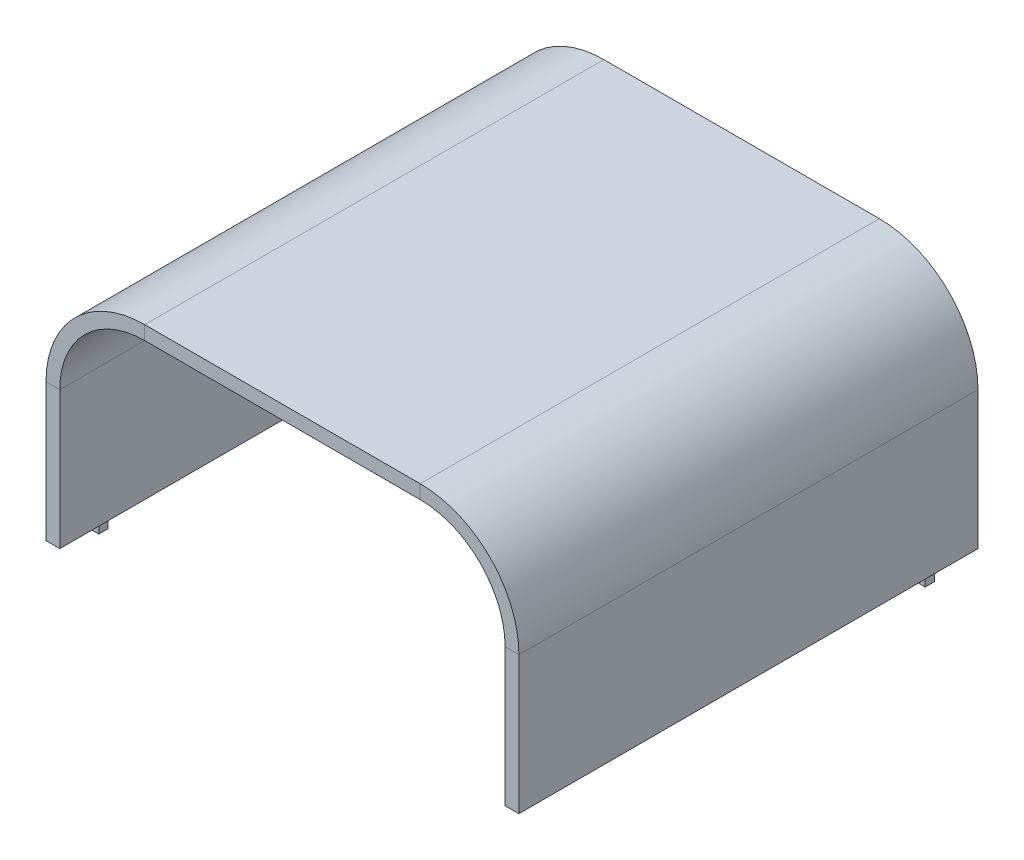
ISO-10303-21;
HEADER;
FILE_DESCRIPTION(('STEP AP214'),'2;1');
FILE_NAME('part.step','',(''),(''),'','','');
FILE_SCHEMA(('AUTOMOTIVE_DESIGN { 1 0 10303 214 1 1 1 1 }'));
ENDSEC;
DATA;
#1=APPLICATION_CONTEXT('core data for automotive mechanical design processes');
#2=APPLICATION_PROTOCOL_DEFINITION('international standard','automotive_design',2000,#1);
#3=PRODUCT_CONTEXT('',#1,'mechanical');
#4=PRODUCT('Part','Part','',(#3));
#5=PRODUCT_RELATED_PRODUCT_CATEGORY('part','',(#4));
#6=PRODUCT_DEFINITION_FORMATION('','',#4);
#7=PRODUCT_DEFINITION_CONTEXT('part definition',#1,'design');
#8=PRODUCT_DEFINITION('design','',#6,#7);
#9=PRODUCT_DEFINITION_SHAPE('','',#8);
#10=(LENGTH_UNIT() NAMED_UNIT(*) SI_UNIT(.MILLI.,.METRE.));
#11=(NAMED_UNIT(*) PLANE_ANGLE_UNIT() SI_UNIT($,.RADIAN.));
#12=(NAMED_UNIT(*) SI_UNIT($,.STERADIAN.) SOLID_ANGLE_UNIT());
#13=UNCERTAINTY_MEASURE_WITH_UNIT(LENGTH_MEASURE(1.E-05),#10,'distance_accuracy_value','');
#14=(GEOMETRIC_REPRESENTATION_CONTEXT(3) GLOBAL_UNCERTAINTY_ASSIGNED_CONTEXT((#13)) GLOBAL_UNIT_ASSIGNED_CONTEXT((#10,
#11,#12)) REPRESENTATION_CONTEXT('',''));
#15=CARTESIAN_POINT('',(0.,0.,0.));
#16=DIRECTION('',(0.,0.,1.));
#17=DIRECTION('',(1.,0.,0.));
#18=AXIS2_PLACEMENT_3D('',#15,#16,#17);
#19=CARTESIAN_POINT('',(0.,0.,0.));
#20=DIRECTION('',(0.,-1.,0.));
#21=DIRECTION('',(0.,0.,-1.));
#22=AXIS2_PLACEMENT_3D('',#19,#20,#21);
#23=PLANE('',#22);
#24=DIRECTION('',(0.,0.,-1.));
#25=VECTOR('',#24,1.);
#26=CARTESIAN_POINT('',(-244.999999999999,0.,-6.80011602582914E-13));
#27=LINE('',#26,#25);
#28=CARTESIAN_POINT('',(-245.,0.,205.));
#29=VERTEX_POINT('',#28);
#30=CARTESIAN_POINT('',(-245.,0.,195.));
#31=VERTEX_POINT('',#30);
#32=EDGE_CURVE('E315',#29,#31,#27,.T.);
#33=ORIENTED_EDGE('',*,*,#32,.T.);
#34=DIRECTION('',(1.,0.,0.));
#35=VECTOR('',#34,1.);
#36=CARTESIAN_POINT('',(0.,0.,195.));
#37=LINE('',#36,#35);
#38=CARTESIAN_POINT('',(-255.,0.,195.));
#39=VERTEX_POINT('',#38);
#40=EDGE_CURVE('E320',#39,#31,#37,.T.);
#41=ORIENTED_EDGE('',*,*,#40,.F.);
#42=DIRECTION('',(0.,0.,-1.));
#43=VECTOR('',#42,1.);
#44=CARTESIAN_POINT('',(-255.,0.,0.));
#45=LINE('',#44,#43);
#46=CARTESIAN_POINT('',(-255.,0.,205.));
#47=VERTEX_POINT('',#46);
#48=EDGE_CURVE('E333',#47,#39,#45,.T.);
#49=ORIENTED_EDGE('',*,*,#48,.F.);
#50=DIRECTION('',(1.,0.,0.));
#51=VECTOR('',#50,1.);
#52=CARTESIAN_POINT('',(5.68989300120396E-13,0.,204.999999999999));
#53=LINE('',#52,#51);
#54=EDGE_CURVE('E330',#47,#29,#53,.T.);
#55=ORIENTED_EDGE('',*,*,#54,.T.);
#56=EDGE_LOOP('',(#33,#41,#49,#55));
#57=FACE_BOUND('',#56,.T.);
#58=DIRECTION('',(0.,0.,-1.));
#59=VECTOR('',#58,1.);
#60=CARTESIAN_POINT('',(-242.5,0.,249.999999999999));
#61=LINE('',#60,#59);
#62=CARTESIAN_POINT('',(-242.5,0.,249.999999999999));
#63=VERTEX_POINT('',#62);
#64=CARTESIAN_POINT('',(-242.5,0.,-250.000000000001));
#65=VERTEX_POINT('',#64);
#66=EDGE_CURVE('E345',#63,#65,#61,.T.);
#67=ORIENTED_EDGE('',*,*,#66,.F.);
#68=DIRECTION('',(1.,0.,0.));
#69=VECTOR('',#68,1.);
#70=CARTESIAN_POINT('',(-257.5,0.,249.999999999999));
#71=LINE('',#70,#69);
#72=CARTESIAN_POINT('',(-257.5,0.,249.999999999999));
#73=VERTEX_POINT('',#72);
#74=EDGE_CURVE('E359',#73,#63,#71,.T.);
#75=ORIENTED_EDGE('',*,*,#74,.F.);
#76=DIRECTION('',(0.,0.,1.));
#77=VECTOR('',#76,1.);
#78=CARTESIAN_POINT('',(-257.5,0.,249.999999999999));
#79=LINE('',#78,#77);
#80=CARTESIAN_POINT('',(-257.5,0.,-250.000000000001));
#81=VERTEX_POINT('',#80);
#82=EDGE_CURVE('E405',#81,#73,#79,.T.);
#83=ORIENTED_EDGE('',*,*,#82,.F.);
#84=DIRECTION('',(-1.,0.,0.));
#85=VECTOR('',#84,1.);
#86=CARTESIAN_POINT('',(-257.5,0.,-250.000000000001));
#87=LINE('',#86,#85);
#88=EDGE_CURVE('E348',#65,#81,#87,.T.);
#89=ORIENTED_EDGE('',*,*,#88,.F.);
#90=EDGE_LOOP('',(#67,#75,#83,#89));
#91=FACE_BOUND('',#90,.T.);
#92=DIRECTION('',(1.,0.,0.));
#93=VECTOR('',#92,1.);
#94=CARTESIAN_POINT('',(-5.41233724504769E-13,0.,-195.000000000001));
#95=LINE('',#94,#93);
#96=CARTESIAN_POINT('',(-255.,0.,-195.));
#97=VERTEX_POINT('',#96);
#98=CARTESIAN_POINT('',(-245.,0.,-195.));
#99=VERTEX_POINT('',#98);
#100=EDGE_CURVE('E246',#97,#99,#95,.T.);
#101=ORIENTED_EDGE('',*,*,#100,.T.);
#102=DIRECTION('',(0.,0.,-1.));
#103=VECTOR('',#102,1.);
#104=CARTESIAN_POINT('',(-245.,0.,0.));
#105=LINE('',#104,#103);
#106=CARTESIAN_POINT('',(-245.,0.,-205.));
#107=VERTEX_POINT('',#106);
#108=EDGE_CURVE('E48',#99,#107,#105,.T.);
#109=ORIENTED_EDGE('',*,*,#108,.T.);
#110=DIRECTION('',(1.,0.,0.));
#111=VECTOR('',#110,1.);
#112=CARTESIAN_POINT('',(-5.68989300120398E-13,0.,-205.000000000001));
#113=LINE('',#112,#111);
#114=CARTESIAN_POINT('',(-255.,0.,-205.));
#115=VERTEX_POINT('',#114);
#116=EDGE_CURVE('E237',#115,#107,#113,.T.);
#117=ORIENTED_EDGE('',*,*,#116,.F.);
#118=DIRECTION('',(0.,0.,-1.));
#119=VECTOR('',#118,1.);
#120=CARTESIAN_POINT('',(-255.,0.,0.));
#121=LINE('',#120,#119);
#122=EDGE_CURVE('E240',#97,#115,#121,.T.);
#123=ORIENTED_EDGE('',*,*,#122,.F.);
#124=EDGE_LOOP('',(#101,#109,#117,#123));
#125=FACE_BOUND('',#124,.T.);
#126=ADVANCED_FACE('F34',(#57,#91,#125),#23,.T.);
#127=CARTESIAN_POINT('',(0.,0.,0.));
#128=DIRECTION('',(0.,1.,0.));
#129=DIRECTION('',(0.,0.,-1.));
#130=AXIS2_PLACEMENT_3D('',#127,#128,#129);
#131=PLANE('',#130);
#132=DIRECTION('',(1.,0.,0.));
#133=VECTOR('',#132,1.);
#134=CARTESIAN_POINT('',(245.,0.,195.));
#135=LINE('',#134,#133);
#136=CARTESIAN_POINT('',(245.,0.,195.));
#137=VERTEX_POINT('',#136);
#138=CARTESIAN_POINT('',(255.,0.,195.));
#139=VERTEX_POINT('',#138);
#140=EDGE_CURVE('E272',#137,#139,#135,.T.);
#141=ORIENTED_EDGE('',*,*,#140,.F.);
#142=DIRECTION('',(0.,0.,-1.));
#143=VECTOR('',#142,1.);
#144=CARTESIAN_POINT('',(245.,0.,205.));
#145=LINE('',#144,#143);
#146=CARTESIAN_POINT('',(245.,0.,205.));
#147=VERTEX_POINT('',#146);
#148=EDGE_CURVE('E56',#147,#137,#145,.T.);
#149=ORIENTED_EDGE('',*,*,#148,.F.);
#150=DIRECTION('',(1.,0.,0.));
#151=VECTOR('',#150,1.);
#152=CARTESIAN_POINT('',(245.,0.,205.));
#153=LINE('',#152,#151);
#154=CARTESIAN_POINT('',(255.,0.,205.));
#155=VERTEX_POINT('',#154);
#156=EDGE_CURVE('E265',#147,#155,#153,.T.);
#157=ORIENTED_EDGE('',*,*,#156,.T.);
#158=DIRECTION('',(0.,0.,-1.));
#159=VECTOR('',#158,1.);
#160=CARTESIAN_POINT('',(255.,0.,205.));
#161=LINE('',#160,#159);
#162=EDGE_CURVE('E268',#155,#139,#161,.T.);
#163=ORIENTED_EDGE('',*,*,#162,.T.);
#164=EDGE_LOOP('',(#141,#149,#157,#163));
#165=FACE_BOUND('',#164,.T.);
#166=DIRECTION('',(1.,0.,0.));
#167=VECTOR('',#166,1.);
#168=CARTESIAN_POINT('',(5.41233724504768E-13,0.,-195.000000000001));
#169=LINE('',#168,#167);
#170=CARTESIAN_POINT('',(245.,0.,-195.));
#171=VERTEX_POINT('',#170);
#172=CARTESIAN_POINT('',(255.,0.,-195.));
#173=VERTEX_POINT('',#172);
#174=EDGE_CURVE('E297',#171,#173,#169,.T.);
#175=ORIENTED_EDGE('',*,*,#174,.T.);
#176=DIRECTION('',(0.,0.,-1.));
#177=VECTOR('',#176,1.);
#178=CARTESIAN_POINT('',(255.000000000001,0.,-1.41553435639709E-12));
#179=LINE('',#178,#177);
#180=CARTESIAN_POINT('',(255.,0.,-205.));
#181=VERTEX_POINT('',#180);
#182=EDGE_CURVE('E252',#173,#181,#179,.T.);
#183=ORIENTED_EDGE('',*,*,#182,.T.);
#184=DIRECTION('',(1.,0.,0.));
#185=VECTOR('',#184,1.);
#186=CARTESIAN_POINT('',(0.,0.,-205.));
#187=LINE('',#186,#185);
#188=CARTESIAN_POINT('',(245.,0.,-205.));
#189=VERTEX_POINT('',#188);
#190=EDGE_CURVE('E288',#189,#181,#187,.T.);
#191=ORIENTED_EDGE('',*,*,#190,.F.);
#192=DIRECTION('',(0.,0.,-1.));
#193=VECTOR('',#192,1.);
#194=CARTESIAN_POINT('',(245.,0.,0.));
#195=LINE('',#194,#193);
#196=EDGE_CURVE('E299',#171,#189,#195,.T.);
#197=ORIENTED_EDGE('',*,*,#196,.F.);
#198=EDGE_LOOP('',(#175,#183,#191,#197));
#199=FACE_BOUND('',#198,.T.);
#200=DIRECTION('',(0.,0.,-1.));
#201=VECTOR('',#200,1.);
#202=CARTESIAN_POINT('',(242.5,0.,249.999999999999));
#203=LINE('',#202,#201);
#204=CARTESIAN_POINT('',(242.5,0.,249.999999999999));
#205=VERTEX_POINT('',#204);
#206=CARTESIAN_POINT('',(242.5,0.,-250.000000000001));
#207=VERTEX_POINT('',#206);
#208=EDGE_CURVE('E393',#205,#207,#203,.T.);
#209=ORIENTED_EDGE('',*,*,#208,.T.);
#210=DIRECTION('',(1.,0.,0.));
#211=VECTOR('',#210,1.);
#212=CARTESIAN_POINT('',(257.5,0.,-250.000000000001));
#213=LINE('',#212,#211);
#214=CARTESIAN_POINT('',(257.5,0.,-250.000000000001));
#215=VERTEX_POINT('',#214);
#216=EDGE_CURVE('E399',#207,#215,#213,.T.);
#217=ORIENTED_EDGE('',*,*,#216,.T.);
#218=DIRECTION('',(0.,0.,1.));
#219=VECTOR('',#218,1.);
#220=CARTESIAN_POINT('',(257.5,0.,249.999999999999));
#221=LINE('',#220,#219);
#222=CARTESIAN_POINT('',(257.5,0.,249.999999999999));
#223=VERTEX_POINT('',#222);
#224=EDGE_CURVE('E434',#215,#223,#221,.T.);
#225=ORIENTED_EDGE('',*,*,#224,.T.);
#226=DIRECTION('',(-1.,0.,0.));
#227=VECTOR('',#226,1.);
#228=CARTESIAN_POINT('',(257.5,0.,249.999999999999));
#229=LINE('',#228,#227);
#230=EDGE_CURVE('E11',#223,#205,#229,.T.);
#231=ORIENTED_EDGE('',*,*,#230,.T.);
#232=EDGE_LOOP('',(#209,#217,#225,#231));
#233=FACE_BOUND('',#232,.T.);
#234=ADVANCED_FACE('F523',(#165,#199,#233),#131,.F.);
#235=CARTESIAN_POINT('',(-242.5,0.,249.999999999999));
#236=DIRECTION('',(1.,0.,0.));
#237=DIRECTION('',(0.,0.,-1.));
#238=AXIS2_PLACEMENT_3D('',#235,#236,#237);
#239=PLANE('',#238);
#240=DIRECTION('',(0.,1.,0.));
#241=VECTOR('',#240,1.);
#242=CARTESIAN_POINT('',(-242.5,0.,-250.000000000001));
#243=LINE('',#242,#241);
#244=CARTESIAN_POINT('',(-242.5,149.999999999999,-250.000000000001));
#245=VERTEX_POINT('',#244);
#246=EDGE_CURVE('E352',#65,#245,#243,.T.);
#247=ORIENTED_EDGE('',*,*,#246,.T.);
#248=DIRECTION('',(0.,0.,-1.));
#249=VECTOR('',#248,1.);
#250=CARTESIAN_POINT('',(-242.5,149.999999999999,249.999999999999));
#251=LINE('',#250,#249);
#252=CARTESIAN_POINT('',(-242.5,149.999999999999,249.999999999999));
#253=VERTEX_POINT('',#252);
#254=EDGE_CURVE('E349',#253,#245,#251,.T.);
#255=ORIENTED_EDGE('',*,*,#254,.F.);
#256=DIRECTION('',(0.,1.,0.));
#257=VECTOR('',#256,1.);
#258=CARTESIAN_POINT('',(-242.5,0.,249.999999999999));
#259=LINE('',#258,#257);
#260=EDGE_CURVE('E353',#63,#253,#259,.T.);
#261=ORIENTED_EDGE('',*,*,#260,.F.);
#262=ORIENTED_EDGE('',*,*,#66,.T.);
#263=EDGE_LOOP('',(#247,#255,#261,#262));
#264=FACE_BOUND('',#263,.T.);
#265=ADVANCED_FACE('F496',(#264),#239,.T.);
#266=CARTESIAN_POINT('',(-257.5,0.,-250.000000000001));
#267=DIRECTION('',(0.,0.,-1.));
#268=DIRECTION('',(-1.,0.,0.));
#269=AXIS2_PLACEMENT_3D('',#266,#267,#268);
#270=PLANE('',#269);
#271=DIRECTION('',(0.,1.,0.));
#272=VECTOR('',#271,1.);
#273=CARTESIAN_POINT('',(-257.5,0.,-250.000000000001));
#274=LINE('',#273,#272);
#275=CARTESIAN_POINT('',(-257.5,149.999999999999,-250.000000000001));
#276=VERTEX_POINT('',#275);
#277=EDGE_CURVE('E408',#81,#276,#274,.T.);
#278=ORIENTED_EDGE('',*,*,#277,.T.);
#279=DIRECTION('',(-1.,0.,0.));
#280=VECTOR('',#279,1.);
#281=CARTESIAN_POINT('',(-257.5,149.999999999999,-250.000000000001));
#282=LINE('',#281,#280);
#283=EDGE_CURVE('E356',#245,#276,#282,.T.);
#284=ORIENTED_EDGE('',*,*,#283,.F.);
#285=ORIENTED_EDGE('',*,*,#246,.F.);
#286=ORIENTED_EDGE('',*,*,#88,.T.);
#287=EDGE_LOOP('',(#278,#284,#285,#286));
#288=FACE_BOUND('',#287,.T.);
#289=ADVANCED_FACE('F507',(#288),#270,.T.);
#290=CARTESIAN_POINT('',(-257.5,0.,249.999999999999));
#291=DIRECTION('',(-1.,0.,0.));
#292=DIRECTION('',(0.,0.,1.));
#293=AXIS2_PLACEMENT_3D('',#290,#291,#292);
#294=PLANE('',#293);
#295=DIRECTION('',(0.,1.,0.));
#296=VECTOR('',#295,1.);
#297=CARTESIAN_POINT('',(-257.5,0.,249.999999999999));
#298=LINE('',#297,#296);
#299=CARTESIAN_POINT('',(-257.5,149.999999999999,249.999999999999));
#300=VERTEX_POINT('',#299);
#301=EDGE_CURVE('E439',#73,#300,#298,.T.);
#302=ORIENTED_EDGE('',*,*,#301,.T.);
#303=DIRECTION('',(0.,0.,1.));
#304=VECTOR('',#303,1.);
#305=CARTESIAN_POINT('',(-257.5,149.999999999999,249.999999999999));
#306=LINE('',#305,#304);
#307=EDGE_CURVE('E411',#276,#300,#306,.T.);
#308=ORIENTED_EDGE('',*,*,#307,.F.);
#309=ORIENTED_EDGE('',*,*,#277,.F.);
#310=ORIENTED_EDGE('',*,*,#82,.T.);
#311=EDGE_LOOP('',(#302,#308,#309,#310));
#312=FACE_BOUND('',#311,.T.);
#313=ADVANCED_FACE('F503',(#312),#294,.T.);
#314=CARTESIAN_POINT('',(-257.5,0.,249.999999999999));
#315=DIRECTION('',(0.,0.,1.));
#316=DIRECTION('',(1.,0.,0.));
#317=AXIS2_PLACEMENT_3D('',#314,#315,#316);
#318=PLANE('',#317);
#319=DIRECTION('',(1.,0.,0.));
#320=VECTOR('',#319,1.);
#321=CARTESIAN_POINT('',(-257.5,149.999999999999,249.999999999999));
#322=LINE('',#321,#320);
#323=EDGE_CURVE('E370',#300,#253,#322,.T.);
#324=ORIENTED_EDGE('',*,*,#323,.F.);
#325=ORIENTED_EDGE('',*,*,#301,.F.);
#326=ORIENTED_EDGE('',*,*,#74,.T.);
#327=ORIENTED_EDGE('',*,*,#260,.T.);
#328=EDGE_LOOP('',(#324,#325,#326,#327));
#329=FACE_BOUND('',#328,.T.);
#330=ADVANCED_FACE('F498',(#329),#318,.T.);
#331=CARTESIAN_POINT('',(-150.,150.,0.));
#332=DIRECTION('',(0.,0.,-1.));
#333=DIRECTION('',(-1.,0.,0.));
#334=AXIS2_PLACEMENT_3D('',#331,#332,#333);
#335=CYLINDRICAL_SURFACE('',#334,92.5);
#336=CARTESIAN_POINT('',(-150.,150.,-250.000000000001));
#337=DIRECTION('',(0.,0.,-1.));
#338=DIRECTION('',(-1.,0.,0.));
#339=AXIS2_PLACEMENT_3D('',#336,#337,#338);
#340=CIRCLE('',#339,92.5);
#341=CARTESIAN_POINT('',(-149.999999999999,242.5,-250.000000000001));
#342=VERTEX_POINT('',#341);
#343=EDGE_CURVE('E363',#245,#342,#340,.T.);
#344=ORIENTED_EDGE('',*,*,#343,.T.);
#345=DIRECTION('',(0.,0.,-1.));
#346=VECTOR('',#345,1.);
#347=CARTESIAN_POINT('',(-149.999999999999,242.5,249.999999999999));
#348=LINE('',#347,#346);
#349=CARTESIAN_POINT('',(-149.999999999999,242.5,249.999999999999));
#350=VERTEX_POINT('',#349);
#351=EDGE_CURVE('E360',#350,#342,#348,.T.);
#352=ORIENTED_EDGE('',*,*,#351,.F.);
#353=CARTESIAN_POINT('',(-150.,150.,249.999999999999));
#354=DIRECTION('',(0.,0.,-1.));
#355=DIRECTION('',(-1.,0.,0.));
#356=AXIS2_PLACEMENT_3D('',#353,#354,#355);
#357=CIRCLE('',#356,92.5);
#358=EDGE_CURVE('E364',#253,#350,#357,.T.);
#359=ORIENTED_EDGE('',*,*,#358,.F.);
#360=ORIENTED_EDGE('',*,*,#254,.T.);
#361=EDGE_LOOP('',(#344,#352,#359,#360));
#362=FACE_BOUND('',#361,.T.);
#363=ADVANCED_FACE('F488',(#362),#335,.F.);
#364=CARTESIAN_POINT('',(-257.5,150.000000000001,-250.000000000001));
#365=DIRECTION('',(0.,0.,-1.));
#366=DIRECTION('',(-1.,0.,0.));
#367=AXIS2_PLACEMENT_3D('',#364,#365,#366);
#368=PLANE('',#367);
#369=CARTESIAN_POINT('',(-150.,150.,-250.000000000001));
#370=DIRECTION('',(0.,0.,-1.));
#371=DIRECTION('',(-1.,0.,0.));
#372=AXIS2_PLACEMENT_3D('',#369,#370,#371);
#373=CIRCLE('',#372,107.5);
#374=CARTESIAN_POINT('',(-149.999999999999,257.5,-250.000000000001));
#375=VERTEX_POINT('',#374);
#376=EDGE_CURVE('E414',#276,#375,#373,.T.);
#377=ORIENTED_EDGE('',*,*,#376,.T.);
#378=DIRECTION('',(0.,1.,0.));
#379=VECTOR('',#378,1.);
#380=CARTESIAN_POINT('',(-149.999999999999,257.5,-250.000000000001));
#381=LINE('',#380,#379);
#382=EDGE_CURVE('E367',#342,#375,#381,.T.);
#383=ORIENTED_EDGE('',*,*,#382,.F.);
#384=ORIENTED_EDGE('',*,*,#343,.F.);
#385=ORIENTED_EDGE('',*,*,#283,.T.);
#386=EDGE_LOOP('',(#377,#383,#384,#385));
#387=FACE_BOUND('',#386,.T.);
#388=ADVANCED_FACE('F509',(#387),#368,.T.);
#389=CARTESIAN_POINT('',(-150.,150.,0.));
#390=DIRECTION('',(0.,0.,-1.));
#391=DIRECTION('',(-1.,0.,0.));
#392=AXIS2_PLACEMENT_3D('',#389,#390,#391);
#393=CYLINDRICAL_SURFACE('',#392,107.5);
#394=CARTESIAN_POINT('',(-150.,150.,249.999999999999));
#395=DIRECTION('',(0.,0.,-1.));
#396=DIRECTION('',(-1.,0.,0.));
#397=AXIS2_PLACEMENT_3D('',#394,#395,#396);
#398=CIRCLE('',#397,107.5);
#399=CARTESIAN_POINT('',(-149.999999999999,257.5,249.999999999999));
#400=VERTEX_POINT('',#399);
#401=EDGE_CURVE('E444',#300,#400,#398,.T.);
#402=ORIENTED_EDGE('',*,*,#401,.T.);
#403=DIRECTION('',(0.,0.,1.));
#404=VECTOR('',#403,1.);
#405=CARTESIAN_POINT('',(-149.999999999999,257.5,249.999999999999));
#406=LINE('',#405,#404);
#407=EDGE_CURVE('E417',#375,#400,#406,.T.);
#408=ORIENTED_EDGE('',*,*,#407,.F.);
#409=ORIENTED_EDGE('',*,*,#376,.F.);
#410=ORIENTED_EDGE('',*,*,#307,.T.);
#411=EDGE_LOOP('',(#402,#408,#409,#410));
#412=FACE_BOUND('',#411,.T.);
#413=ADVANCED_FACE('F535',(#412),#393,.T.);
#414=CARTESIAN_POINT('',(-257.5,150.000000000001,249.999999999999));
#415=DIRECTION('',(0.,0.,1.));
#416=DIRECTION('',(1.,0.,0.));
#417=AXIS2_PLACEMENT_3D('',#414,#415,#416);
#418=PLANE('',#417);
#419=DIRECTION('',(0.,-1.,0.));
#420=VECTOR('',#419,1.);
#421=CARTESIAN_POINT('',(-149.999999999999,257.5,249.999999999999));
#422=LINE('',#421,#420);
#423=EDGE_CURVE('E381',#400,#350,#422,.T.);
#424=ORIENTED_EDGE('',*,*,#423,.F.);
#425=ORIENTED_EDGE('',*,*,#401,.F.);
#426=ORIENTED_EDGE('',*,*,#323,.T.);
#427=ORIENTED_EDGE('',*,*,#358,.T.);
#428=EDGE_LOOP('',(#424,#425,#426,#427));
#429=FACE_BOUND('',#428,.T.);
#430=ADVANCED_FACE('F489',(#429),#418,.T.);
#431=CARTESIAN_POINT('',(-149.999999999999,242.5,249.999999999999));
#432=DIRECTION('',(0.,-1.,0.));
#433=DIRECTION('',(1.,0.,0.));
#434=AXIS2_PLACEMENT_3D('',#431,#432,#433);
#435=PLANE('',#434);
#436=DIRECTION('',(1.,0.,0.));
#437=VECTOR('',#436,1.);
#438=CARTESIAN_POINT('',(-149.999999999999,242.5,-250.000000000001));
#439=LINE('',#438,#437);
#440=CARTESIAN_POINT('',(149.999999999999,242.5,-250.000000000001));
#441=VERTEX_POINT('',#440);
#442=EDGE_CURVE('E374',#342,#441,#439,.T.);
#443=ORIENTED_EDGE('',*,*,#442,.T.);
#444=DIRECTION('',(0.,0.,-1.));
#445=VECTOR('',#444,1.);
#446=CARTESIAN_POINT('',(149.999999999999,242.5,249.999999999999));
#447=LINE('',#446,#445);
#448=CARTESIAN_POINT('',(149.999999999999,242.5,249.999999999999));
#449=VERTEX_POINT('',#448);
#450=EDGE_CURVE('E371',#449,#441,#447,.T.);
#451=ORIENTED_EDGE('',*,*,#450,.F.);
#452=DIRECTION('',(1.,0.,0.));
#453=VECTOR('',#452,1.);
#454=CARTESIAN_POINT('',(-149.999999999999,242.5,249.999999999999));
#455=LINE('',#454,#453);
#456=EDGE_CURVE('E375',#350,#449,#455,.T.);
#457=ORIENTED_EDGE('',*,*,#456,.F.);
#458=ORIENTED_EDGE('',*,*,#351,.T.);
#459=EDGE_LOOP('',(#443,#451,#457,#458));
#460=FACE_BOUND('',#459,.T.);
#461=ADVANCED_FACE('F482',(#460),#435,.T.);
#462=CARTESIAN_POINT('',(-149.999999999999,257.5,-250.000000000001));
#463=DIRECTION('',(0.,0.,-1.));
#464=DIRECTION('',(-1.,0.,0.));
#465=AXIS2_PLACEMENT_3D('',#462,#463,#464);
#466=PLANE('',#465);
#467=DIRECTION('',(1.,0.,0.));
#468=VECTOR('',#467,1.);
#469=CARTESIAN_POINT('',(-149.999999999999,257.5,-250.000000000001));
#470=LINE('',#469,#468);
#471=CARTESIAN_POINT('',(149.999999999999,257.5,-250.000000000001));
#472=VERTEX_POINT('',#471);
#473=EDGE_CURVE('E420',#375,#472,#470,.T.);
#474=ORIENTED_EDGE('',*,*,#473,.T.);
#475=DIRECTION('',(0.,1.,0.));
#476=VECTOR('',#475,1.);
#477=CARTESIAN_POINT('',(149.999999999999,257.5,-250.000000000001));
#478=LINE('',#477,#476);
#479=EDGE_CURVE('E378',#441,#472,#478,.T.);
#480=ORIENTED_EDGE('',*,*,#479,.F.);
#481=ORIENTED_EDGE('',*,*,#442,.F.);
#482=ORIENTED_EDGE('',*,*,#382,.T.);
#483=EDGE_LOOP('',(#474,#480,#481,#482));
#484=FACE_BOUND('',#483,.T.);
#485=ADVANCED_FACE('F512',(#484),#466,.T.);
#486=CARTESIAN_POINT('',(-149.999999999999,257.5,249.999999999999));
#487=DIRECTION('',(0.,1.,0.));
#488=DIRECTION('',(-1.,0.,0.));
#489=AXIS2_PLACEMENT_3D('',#486,#487,#488);
#490=PLANE('',#489);
#491=DIRECTION('',(1.,0.,0.));
#492=VECTOR('',#491,1.);
#493=CARTESIAN_POINT('',(-149.999999999999,257.5,249.999999999999));
#494=LINE('',#493,#492);
#495=CARTESIAN_POINT('',(149.999999999999,257.5,249.999999999999));
#496=VERTEX_POINT('',#495);
#497=EDGE_CURVE('E449',#400,#496,#494,.T.);
#498=ORIENTED_EDGE('',*,*,#497,.T.);
#499=DIRECTION('',(0.,0.,1.));
#500=VECTOR('',#499,1.);
#501=CARTESIAN_POINT('',(149.999999999999,257.5,249.999999999999));
#502=LINE('',#501,#500);
#503=EDGE_CURVE('E423',#472,#496,#502,.T.);
#504=ORIENTED_EDGE('',*,*,#503,.F.);
#505=ORIENTED_EDGE('',*,*,#473,.F.);
#506=ORIENTED_EDGE('',*,*,#407,.T.);
#507=EDGE_LOOP('',(#498,#504,#505,#506));
#508=FACE_BOUND('',#507,.T.);
#509=ADVANCED_FACE('F532',(#508),#490,.T.);
#510=CARTESIAN_POINT('',(-149.999999999999,257.5,249.999999999999));
#511=DIRECTION('',(0.,0.,1.));
#512=DIRECTION('',(1.,0.,0.));
#513=AXIS2_PLACEMENT_3D('',#510,#511,#512);
#514=PLANE('',#513);
#515=DIRECTION('',(0.,-1.,0.));
#516=VECTOR('',#515,1.);
#517=CARTESIAN_POINT('',(149.999999999999,257.5,249.999999999999));
#518=LINE('',#517,#516);
#519=EDGE_CURVE('E392',#496,#449,#518,.T.);
#520=ORIENTED_EDGE('',*,*,#519,.F.);
#521=ORIENTED_EDGE('',*,*,#497,.F.);
#522=ORIENTED_EDGE('',*,*,#423,.T.);
#523=ORIENTED_EDGE('',*,*,#456,.T.);
#524=EDGE_LOOP('',(#520,#521,#522,#523));
#525=FACE_BOUND('',#524,.T.);
#526=ADVANCED_FACE('F483',(#525),#514,.T.);
#527=CARTESIAN_POINT('',(150.,150.,0.));
#528=DIRECTION('',(0.,0.,-1.));
#529=DIRECTION('',(-1.,0.,0.));
#530=AXIS2_PLACEMENT_3D('',#527,#528,#529);
#531=CYLINDRICAL_SURFACE('',#530,92.5);
#532=CARTESIAN_POINT('',(150.,150.,-250.000000000001));
#533=DIRECTION('',(0.,0.,-1.));
#534=DIRECTION('',(0.,1.,0.));
#535=AXIS2_PLACEMENT_3D('',#532,#533,#534);
#536=CIRCLE('',#535,92.5);
#537=CARTESIAN_POINT('',(242.5,149.999999999999,-250.000000000001));
#538=VERTEX_POINT('',#537);
#539=EDGE_CURVE('E385',#441,#538,#536,.T.);
#540=ORIENTED_EDGE('',*,*,#539,.T.);
#541=DIRECTION('',(0.,0.,-1.));
#542=VECTOR('',#541,1.);
#543=CARTESIAN_POINT('',(242.5,149.999999999999,249.999999999999));
#544=LINE('',#543,#542);
#545=CARTESIAN_POINT('',(242.5,149.999999999999,249.999999999999));
#546=VERTEX_POINT('',#545);
#547=EDGE_CURVE('E382',#546,#538,#544,.T.);
#548=ORIENTED_EDGE('',*,*,#547,.F.);
#549=CARTESIAN_POINT('',(150.,150.,249.999999999999));
#550=DIRECTION('',(0.,0.,-1.));
#551=DIRECTION('',(0.,1.,0.));
#552=AXIS2_PLACEMENT_3D('',#549,#550,#551);
#553=CIRCLE('',#552,92.5);
#554=EDGE_CURVE('E386',#449,#546,#553,.T.);
#555=ORIENTED_EDGE('',*,*,#554,.F.);
#556=ORIENTED_EDGE('',*,*,#450,.T.);
#557=EDGE_LOOP('',(#540,#548,#555,#556));
#558=FACE_BOUND('',#557,.T.);
#559=ADVANCED_FACE('F475',(#558),#531,.F.);
#560=CARTESIAN_POINT('',(149.999999999999,257.5,-250.000000000001));
#561=DIRECTION('',(0.,0.,-1.));
#562=DIRECTION('',(-1.,0.,0.));
#563=AXIS2_PLACEMENT_3D('',#560,#561,#562);
#564=PLANE('',#563);
#565=CARTESIAN_POINT('',(150.,150.,-250.000000000001));
#566=DIRECTION('',(0.,0.,-1.));
#567=DIRECTION('',(0.,1.,0.));
#568=AXIS2_PLACEMENT_3D('',#565,#566,#567);
#569=CIRCLE('',#568,107.5);
#570=CARTESIAN_POINT('',(257.5,149.999999999999,-250.000000000001));
#571=VERTEX_POINT('',#570);
#572=EDGE_CURVE('E426',#472,#571,#569,.T.);
#573=ORIENTED_EDGE('',*,*,#572,.T.);
#574=DIRECTION('',(1.,0.,0.));
#575=VECTOR('',#574,1.);
#576=CARTESIAN_POINT('',(257.5,149.999999999999,-250.000000000001));
#577=LINE('',#576,#575);
#578=EDGE_CURVE('E389',#538,#571,#577,.T.);
#579=ORIENTED_EDGE('',*,*,#578,.F.);
#580=ORIENTED_EDGE('',*,*,#539,.F.);
#581=ORIENTED_EDGE('',*,*,#479,.T.);
#582=EDGE_LOOP('',(#573,#579,#580,#581));
#583=FACE_BOUND('',#582,.T.);
#584=ADVANCED_FACE('F515',(#583),#564,.T.);
#585=CARTESIAN_POINT('',(150.,150.,0.));
#586=DIRECTION('',(0.,0.,-1.));
#587=DIRECTION('',(-1.,0.,0.));
#588=AXIS2_PLACEMENT_3D('',#585,#586,#587);
#589=CYLINDRICAL_SURFACE('',#588,107.5);
#590=CARTESIAN_POINT('',(150.,150.,249.999999999999));
#591=DIRECTION('',(0.,0.,-1.));
#592=DIRECTION('',(0.,1.,0.));
#593=AXIS2_PLACEMENT_3D('',#590,#591,#592);
#594=CIRCLE('',#593,107.5);
#595=CARTESIAN_POINT('',(257.5,149.999999999999,249.999999999999));
#596=VERTEX_POINT('',#595);
#597=EDGE_CURVE('E454',#496,#596,#594,.T.);
#598=ORIENTED_EDGE('',*,*,#597,.T.);
#599=DIRECTION('',(0.,0.,1.));
#600=VECTOR('',#599,1.);
#601=CARTESIAN_POINT('',(257.5,149.999999999999,249.999999999999));
#602=LINE('',#601,#600);
#603=EDGE_CURVE('E429',#571,#596,#602,.T.);
#604=ORIENTED_EDGE('',*,*,#603,.F.);
#605=ORIENTED_EDGE('',*,*,#572,.F.);
#606=ORIENTED_EDGE('',*,*,#503,.T.);
#607=EDGE_LOOP('',(#598,#604,#605,#606));
#608=FACE_BOUND('',#607,.T.);
#609=ADVANCED_FACE('F529',(#608),#589,.T.);
#610=CARTESIAN_POINT('',(149.999999999999,257.5,249.999999999999));
#611=DIRECTION('',(0.,0.,1.));
#612=DIRECTION('',(1.,0.,0.));
#613=AXIS2_PLACEMENT_3D('',#610,#611,#612);
#614=PLANE('',#613);
#615=DIRECTION('',(-1.,0.,0.));
#616=VECTOR('',#615,1.);
#617=CARTESIAN_POINT('',(257.5,149.999999999999,249.999999999999));
#618=LINE('',#617,#616);
#619=EDGE_CURVE('E402',#596,#546,#618,.T.);
#620=ORIENTED_EDGE('',*,*,#619,.F.);
#621=ORIENTED_EDGE('',*,*,#597,.F.);
#622=ORIENTED_EDGE('',*,*,#519,.T.);
#623=ORIENTED_EDGE('',*,*,#554,.T.);
#624=EDGE_LOOP('',(#620,#621,#622,#623));
#625=FACE_BOUND('',#624,.T.);
#626=ADVANCED_FACE('F477',(#625),#614,.T.);
#627=CARTESIAN_POINT('',(242.5,149.999999999999,249.999999999999));
#628=DIRECTION('',(-1.,0.,0.));
#629=DIRECTION('',(0.,-1.,0.));
#630=AXIS2_PLACEMENT_3D('',#627,#628,#629);
#631=PLANE('',#630);
#632=DIRECTION('',(0.,-1.,0.));
#633=VECTOR('',#632,1.);
#634=CARTESIAN_POINT('',(242.5,149.999999999999,-250.000000000001));
#635=LINE('',#634,#633);
#636=EDGE_CURVE('E395',#538,#207,#635,.T.);
#637=ORIENTED_EDGE('',*,*,#636,.T.);
#638=ORIENTED_EDGE('',*,*,#208,.F.);
#639=DIRECTION('',(0.,-1.,0.));
#640=VECTOR('',#639,1.);
#641=CARTESIAN_POINT('',(242.5,149.999999999999,249.999999999999));
#642=LINE('',#641,#640);
#643=EDGE_CURVE('E396',#546,#205,#642,.T.);
#644=ORIENTED_EDGE('',*,*,#643,.F.);
#645=ORIENTED_EDGE('',*,*,#547,.T.);
#646=EDGE_LOOP('',(#637,#638,#644,#645));
#647=FACE_BOUND('',#646,.T.);
#648=ADVANCED_FACE('F521',(#647),#631,.T.);
#649=CARTESIAN_POINT('',(257.5,149.999999999999,-250.000000000001));
#650=DIRECTION('',(0.,0.,-1.));
#651=DIRECTION('',(-1.,0.,0.));
#652=AXIS2_PLACEMENT_3D('',#649,#650,#651);
#653=PLANE('',#652);
#654=DIRECTION('',(0.,-1.,0.));
#655=VECTOR('',#654,1.);
#656=CARTESIAN_POINT('',(257.5,149.999999999999,-250.000000000001));
#657=LINE('',#656,#655);
#658=EDGE_CURVE('E431',#571,#215,#657,.T.);
#659=ORIENTED_EDGE('',*,*,#658,.T.);
#660=ORIENTED_EDGE('',*,*,#216,.F.);
#661=ORIENTED_EDGE('',*,*,#636,.F.);
#662=ORIENTED_EDGE('',*,*,#578,.T.);
#663=EDGE_LOOP('',(#659,#660,#661,#662));
#664=FACE_BOUND('',#663,.T.);
#665=ADVANCED_FACE('F518',(#664),#653,.T.);
#666=CARTESIAN_POINT('',(257.5,149.999999999999,249.999999999999));
#667=DIRECTION('',(1.,0.,0.));
#668=DIRECTION('',(0.,1.,0.));
#669=AXIS2_PLACEMENT_3D('',#666,#667,#668);
#670=PLANE('',#669);
#671=DIRECTION('',(0.,-1.,0.));
#672=VECTOR('',#671,1.);
#673=CARTESIAN_POINT('',(257.5,149.999999999999,249.999999999999));
#674=LINE('',#673,#672);
#675=EDGE_CURVE('E41',#596,#223,#674,.T.);
#676=ORIENTED_EDGE('',*,*,#675,.T.);
#677=ORIENTED_EDGE('',*,*,#224,.F.);
#678=ORIENTED_EDGE('',*,*,#658,.F.);
#679=ORIENTED_EDGE('',*,*,#603,.T.);
#680=EDGE_LOOP('',(#676,#677,#678,#679));
#681=FACE_BOUND('',#680,.T.);
#682=ADVANCED_FACE('F526',(#681),#670,.T.);
#683=CARTESIAN_POINT('',(257.5,149.999999999999,249.999999999999));
#684=DIRECTION('',(0.,0.,1.));
#685=DIRECTION('',(1.,0.,0.));
#686=AXIS2_PLACEMENT_3D('',#683,#684,#685);
#687=PLANE('',#686);
#688=ORIENTED_EDGE('',*,*,#230,.F.);
#689=ORIENTED_EDGE('',*,*,#675,.F.);
#690=ORIENTED_EDGE('',*,*,#619,.T.);
#691=ORIENTED_EDGE('',*,*,#643,.T.);
#692=EDGE_LOOP('',(#688,#689,#690,#691));
#693=FACE_BOUND('',#692,.T.);
#694=ADVANCED_FACE('F472',(#693),#687,.T.);
#695=CARTESIAN_POINT('',(-244.999999999999,-10.,-6.80011602582914E-13));
#696=DIRECTION('',(1.,0.,0.));
#697=DIRECTION('',(0.,0.,-1.));
#698=AXIS2_PLACEMENT_3D('',#695,#696,#697);
#699=PLANE('',#698);
#700=ORIENTED_EDGE('',*,*,#32,.F.);
#701=DIRECTION('',(0.,1.,0.));
#702=VECTOR('',#701,1.);
#703=CARTESIAN_POINT('',(-245.,-10.,205.));
#704=LINE('',#703,#702);
#705=CARTESIAN_POINT('',(-245.,-10.,205.));
#706=VERTEX_POINT('',#705);
#707=EDGE_CURVE('E343',#706,#29,#704,.T.);
#708=ORIENTED_EDGE('',*,*,#707,.F.);
#709=DIRECTION('',(0.,0.,-1.));
#710=VECTOR('',#709,1.);
#711=CARTESIAN_POINT('',(-244.999999999999,-10.,-6.80011602582914E-13));
#712=LINE('',#711,#710);
#713=CARTESIAN_POINT('',(-245.,-10.,195.));
#714=VERTEX_POINT('',#713);
#715=EDGE_CURVE('E316',#706,#714,#712,.T.);
#716=ORIENTED_EDGE('',*,*,#715,.T.);
#717=DIRECTION('',(0.,1.,0.));
#718=VECTOR('',#717,1.);
#719=CARTESIAN_POINT('',(-245.,-10.,195.));
#720=LINE('',#719,#718);
#721=EDGE_CURVE('E327',#714,#31,#720,.T.);
#722=ORIENTED_EDGE('',*,*,#721,.T.);
#723=EDGE_LOOP('',(#700,#708,#716,#722));
#724=FACE_BOUND('',#723,.T.);
#725=ADVANCED_FACE('F552',(#724),#699,.T.);
#726=CARTESIAN_POINT('',(5.68989300120396E-13,-10.,204.999999999999));
#727=DIRECTION('',(0.,0.,1.));
#728=DIRECTION('',(1.,0.,0.));
#729=AXIS2_PLACEMENT_3D('',#726,#727,#728);
#730=PLANE('',#729);
#731=ORIENTED_EDGE('',*,*,#54,.F.);
#732=DIRECTION('',(0.,1.,0.));
#733=VECTOR('',#732,1.);
#734=CARTESIAN_POINT('',(-255.,-10.,205.));
#735=LINE('',#734,#733);
#736=CARTESIAN_POINT('',(-255.,-10.,205.));
#737=VERTEX_POINT('',#736);
#738=EDGE_CURVE('E341',#737,#47,#735,.T.);
#739=ORIENTED_EDGE('',*,*,#738,.F.);
#740=DIRECTION('',(1.,0.,0.));
#741=VECTOR('',#740,1.);
#742=CARTESIAN_POINT('',(5.68989300120396E-13,-10.,204.999999999999));
#743=LINE('',#742,#741);
#744=EDGE_CURVE('E319',#737,#706,#743,.T.);
#745=ORIENTED_EDGE('',*,*,#744,.T.);
#746=ORIENTED_EDGE('',*,*,#707,.T.);
#747=EDGE_LOOP('',(#731,#739,#745,#746));
#748=FACE_BOUND('',#747,.T.);
#749=ADVANCED_FACE('F559',(#748),#730,.T.);
#750=CARTESIAN_POINT('',(-255.,-10.,0.));
#751=DIRECTION('',(1.,0.,0.));
#752=DIRECTION('',(0.,0.,-1.));
#753=AXIS2_PLACEMENT_3D('',#750,#751,#752);
#754=PLANE('',#753);
#755=ORIENTED_EDGE('',*,*,#48,.T.);
#756=DIRECTION('',(0.,1.,0.));
#757=VECTOR('',#756,1.);
#758=CARTESIAN_POINT('',(-255.,-10.,195.));
#759=LINE('',#758,#757);
#760=CARTESIAN_POINT('',(-255.,-10.,195.));
#761=VERTEX_POINT('',#760);
#762=EDGE_CURVE('E339',#761,#39,#759,.T.);
#763=ORIENTED_EDGE('',*,*,#762,.F.);
#764=DIRECTION('',(0.,0.,-1.));
#765=VECTOR('',#764,1.);
#766=CARTESIAN_POINT('',(-255.,-10.,0.));
#767=LINE('',#766,#765);
#768=EDGE_CURVE('E323',#737,#761,#767,.T.);
#769=ORIENTED_EDGE('',*,*,#768,.F.);
#770=ORIENTED_EDGE('',*,*,#738,.T.);
#771=EDGE_LOOP('',(#755,#763,#769,#770));
#772=FACE_BOUND('',#771,.T.);
#773=ADVANCED_FACE('F602',(#772),#754,.F.);
#774=CARTESIAN_POINT('',(0.,-10.,195.));
#775=DIRECTION('',(0.,0.,1.));
#776=DIRECTION('',(1.,0.,0.));
#777=AXIS2_PLACEMENT_3D('',#774,#775,#776);
#778=PLANE('',#777);
#779=ORIENTED_EDGE('',*,*,#40,.T.);
#780=ORIENTED_EDGE('',*,*,#721,.F.);
#781=DIRECTION('',(1.,0.,0.));
#782=VECTOR('',#781,1.);
#783=CARTESIAN_POINT('',(0.,-10.,195.));
#784=LINE('',#783,#782);
#785=EDGE_CURVE('E325',#761,#714,#784,.T.);
#786=ORIENTED_EDGE('',*,*,#785,.F.);
#787=ORIENTED_EDGE('',*,*,#762,.T.);
#788=EDGE_LOOP('',(#779,#780,#786,#787));
#789=FACE_BOUND('',#788,.T.);
#790=ADVANCED_FACE('F606',(#789),#778,.F.);
#791=CARTESIAN_POINT('',(0.,-10.,0.));
#792=DIRECTION('',(0.,-1.,0.));
#793=DIRECTION('',(0.,0.,-1.));
#794=AXIS2_PLACEMENT_3D('',#791,#792,#793);
#795=PLANE('',#794);
#796=ORIENTED_EDGE('',*,*,#715,.F.);
#797=ORIENTED_EDGE('',*,*,#744,.F.);
#798=ORIENTED_EDGE('',*,*,#768,.T.);
#799=ORIENTED_EDGE('',*,*,#785,.T.);
#800=EDGE_LOOP('',(#796,#797,#798,#799));
#801=FACE_BOUND('',#800,.T.);
#802=ADVANCED_FACE('F610',(#801),#795,.T.);
#803=CARTESIAN_POINT('',(255.000000000001,-10.,-1.41553435639709E-12));
#804=DIRECTION('',(1.,0.,0.));
#805=DIRECTION('',(0.,0.,-1.));
#806=AXIS2_PLACEMENT_3D('',#803,#804,#805);
#807=PLANE('',#806);
#808=ORIENTED_EDGE('',*,*,#182,.F.);
#809=DIRECTION('',(0.,1.,0.));
#810=VECTOR('',#809,1.);
#811=CARTESIAN_POINT('',(255.,-10.,-195.));
#812=LINE('',#811,#810);
#813=CARTESIAN_POINT('',(255.,-10.,-195.));
#814=VERTEX_POINT('',#813);
#815=EDGE_CURVE('E312',#814,#173,#812,.T.);
#816=ORIENTED_EDGE('',*,*,#815,.F.);
#817=DIRECTION('',(0.,0.,-1.));
#818=VECTOR('',#817,1.);
#819=CARTESIAN_POINT('',(255.000000000001,-10.,-1.41553435639709E-12));
#820=LINE('',#819,#818);
#821=CARTESIAN_POINT('',(255.,-10.,-205.));
#822=VERTEX_POINT('',#821);
#823=EDGE_CURVE('E284',#814,#822,#820,.T.);
#824=ORIENTED_EDGE('',*,*,#823,.T.);
#825=DIRECTION('',(0.,1.,0.));
#826=VECTOR('',#825,1.);
#827=CARTESIAN_POINT('',(255.,-10.,-205.));
#828=LINE('',#827,#826);
#829=EDGE_CURVE('E295',#822,#181,#828,.T.);
#830=ORIENTED_EDGE('',*,*,#829,.T.);
#831=EDGE_LOOP('',(#808,#816,#824,#830));
#832=FACE_BOUND('',#831,.T.);
#833=ADVANCED_FACE('F614',(#832),#807,.T.);
#834=CARTESIAN_POINT('',(5.41233724504768E-13,-10.,-195.000000000001));
#835=DIRECTION('',(0.,0.,1.));
#836=DIRECTION('',(1.,0.,0.));
#837=AXIS2_PLACEMENT_3D('',#834,#835,#836);
#838=PLANE('',#837);
#839=ORIENTED_EDGE('',*,*,#174,.F.);
#840=DIRECTION('',(0.,1.,0.));
#841=VECTOR('',#840,1.);
#842=CARTESIAN_POINT('',(245.,-10.,-195.));
#843=LINE('',#842,#841);
#844=CARTESIAN_POINT('',(245.,-10.,-195.));
#845=VERTEX_POINT('',#844);
#846=EDGE_CURVE('E309',#845,#171,#843,.T.);
#847=ORIENTED_EDGE('',*,*,#846,.F.);
#848=DIRECTION('',(1.,0.,0.));
#849=VECTOR('',#848,1.);
#850=CARTESIAN_POINT('',(5.41233724504768E-13,-10.,-195.000000000001));
#851=LINE('',#850,#849);
#852=EDGE_CURVE('E287',#845,#814,#851,.T.);
#853=ORIENTED_EDGE('',*,*,#852,.T.);
#854=ORIENTED_EDGE('',*,*,#815,.T.);
#855=EDGE_LOOP('',(#839,#847,#853,#854));
#856=FACE_BOUND('',#855,.T.);
#857=ADVANCED_FACE('F618',(#856),#838,.T.);
#858=CARTESIAN_POINT('',(245.,-10.,0.));
#859=DIRECTION('',(1.,0.,0.));
#860=DIRECTION('',(0.,0.,-1.));
#861=AXIS2_PLACEMENT_3D('',#858,#859,#860);
#862=PLANE('',#861);
#863=ORIENTED_EDGE('',*,*,#196,.T.);
#864=DIRECTION('',(0.,1.,0.));
#865=VECTOR('',#864,1.);
#866=CARTESIAN_POINT('',(245.,-10.,-205.));
#867=LINE('',#866,#865);
#868=CARTESIAN_POINT('',(245.,-10.,-205.));
#869=VERTEX_POINT('',#868);
#870=EDGE_CURVE('E306',#869,#189,#867,.T.);
#871=ORIENTED_EDGE('',*,*,#870,.F.);
#872=DIRECTION('',(0.,0.,-1.));
#873=VECTOR('',#872,1.);
#874=CARTESIAN_POINT('',(245.,-10.,0.));
#875=LINE('',#874,#873);
#876=EDGE_CURVE('E291',#845,#869,#875,.T.);
#877=ORIENTED_EDGE('',*,*,#876,.F.);
#878=ORIENTED_EDGE('',*,*,#846,.T.);
#879=EDGE_LOOP('',(#863,#871,#877,#878));
#880=FACE_BOUND('',#879,.T.);
#881=ADVANCED_FACE('F622',(#880),#862,.F.);
#882=CARTESIAN_POINT('',(0.,-10.,-205.));
#883=DIRECTION('',(0.,0.,1.));
#884=DIRECTION('',(1.,0.,0.));
#885=AXIS2_PLACEMENT_3D('',#882,#883,#884);
#886=PLANE('',#885);
#887=ORIENTED_EDGE('',*,*,#190,.T.);
#888=ORIENTED_EDGE('',*,*,#829,.F.);
#889=DIRECTION('',(1.,0.,0.));
#890=VECTOR('',#889,1.);
#891=CARTESIAN_POINT('',(0.,-10.,-205.));
#892=LINE('',#891,#890);
#893=EDGE_CURVE('E293',#869,#822,#892,.T.);
#894=ORIENTED_EDGE('',*,*,#893,.F.);
#895=ORIENTED_EDGE('',*,*,#870,.T.);
#896=EDGE_LOOP('',(#887,#888,#894,#895));
#897=FACE_BOUND('',#896,.T.);
#898=ADVANCED_FACE('F626',(#897),#886,.F.);
#899=CARTESIAN_POINT('',(0.,-10.,0.));
#900=DIRECTION('',(0.,-1.,0.));
#901=DIRECTION('',(0.,0.,-1.));
#902=AXIS2_PLACEMENT_3D('',#899,#900,#901);
#903=PLANE('',#902);
#904=ORIENTED_EDGE('',*,*,#823,.F.);
#905=ORIENTED_EDGE('',*,*,#852,.F.);
#906=ORIENTED_EDGE('',*,*,#876,.T.);
#907=ORIENTED_EDGE('',*,*,#893,.T.);
#908=EDGE_LOOP('',(#904,#905,#906,#907));
#909=FACE_BOUND('',#908,.T.);
#910=ADVANCED_FACE('F630',(#909),#903,.T.);
#911=CARTESIAN_POINT('',(245.,10.,205.));
#912=DIRECTION('',(-1.,0.,0.));
#913=DIRECTION('',(0.,0.,1.));
#914=AXIS2_PLACEMENT_3D('',#911,#912,#913);
#915=PLANE('',#914);
#916=ORIENTED_EDGE('',*,*,#148,.T.);
#917=DIRECTION('',(0.,-1.,0.));
#918=VECTOR('',#917,1.);
#919=CARTESIAN_POINT('',(245.,10.,195.));
#920=LINE('',#919,#918);
#921=CARTESIAN_POINT('',(245.,10.,195.));
#922=VERTEX_POINT('',#921);
#923=EDGE_CURVE('E256',#922,#137,#920,.T.);
#924=ORIENTED_EDGE('',*,*,#923,.F.);
#925=DIRECTION('',(0.,0.,-1.));
#926=VECTOR('',#925,1.);
#927=CARTESIAN_POINT('',(245.,10.,205.));
#928=LINE('',#927,#926);
#929=CARTESIAN_POINT('',(245.,10.,205.));
#930=VERTEX_POINT('',#929);
#931=EDGE_CURVE('E269',#930,#922,#928,.T.);
#932=ORIENTED_EDGE('',*,*,#931,.F.);
#933=DIRECTION('',(0.,-1.,0.));
#934=VECTOR('',#933,1.);
#935=CARTESIAN_POINT('',(245.,10.,205.));
#936=LINE('',#935,#934);
#937=EDGE_CURVE('E263',#930,#147,#936,.T.);
#938=ORIENTED_EDGE('',*,*,#937,.T.);
#939=EDGE_LOOP('',(#916,#924,#932,#938));
#940=FACE_BOUND('',#939,.T.);
#941=ADVANCED_FACE('F634',(#940),#915,.F.);
#942=CARTESIAN_POINT('',(245.,10.,205.));
#943=DIRECTION('',(0.,0.,-1.));
#944=DIRECTION('',(-1.,0.,0.));
#945=AXIS2_PLACEMENT_3D('',#942,#943,#944);
#946=PLANE('',#945);
#947=ORIENTED_EDGE('',*,*,#156,.F.);
#948=ORIENTED_EDGE('',*,*,#937,.F.);
#949=DIRECTION('',(1.,0.,0.));
#950=VECTOR('',#949,1.);
#951=CARTESIAN_POINT('',(245.,10.,205.));
#952=LINE('',#951,#950);
#953=CARTESIAN_POINT('',(255.,10.,205.));
#954=VERTEX_POINT('',#953);
#955=EDGE_CURVE('E258',#930,#954,#952,.T.);
#956=ORIENTED_EDGE('',*,*,#955,.T.);
#957=DIRECTION('',(0.,-1.,0.));
#958=VECTOR('',#957,1.);
#959=CARTESIAN_POINT('',(255.,10.,205.));
#960=LINE('',#959,#958);
#961=EDGE_CURVE('E261',#954,#155,#960,.T.);
#962=ORIENTED_EDGE('',*,*,#961,.T.);
#963=EDGE_LOOP('',(#947,#948,#956,#962));
#964=FACE_BOUND('',#963,.T.);
#965=ADVANCED_FACE('F641',(#964),#946,.T.);
#966=CARTESIAN_POINT('',(255.,10.,205.));
#967=DIRECTION('',(-1.,0.,0.));
#968=DIRECTION('',(0.,0.,1.));
#969=AXIS2_PLACEMENT_3D('',#966,#967,#968);
#970=PLANE('',#969);
#971=ORIENTED_EDGE('',*,*,#162,.F.);
#972=ORIENTED_EDGE('',*,*,#961,.F.);
#973=DIRECTION('',(0.,0.,-1.));
#974=VECTOR('',#973,1.);
#975=CARTESIAN_POINT('',(255.,10.,205.));
#976=LINE('',#975,#974);
#977=CARTESIAN_POINT('',(255.,10.,195.));
#978=VERTEX_POINT('',#977);
#979=EDGE_CURVE('E277',#954,#978,#976,.T.);
#980=ORIENTED_EDGE('',*,*,#979,.T.);
#981=DIRECTION('',(0.,-1.,0.));
#982=VECTOR('',#981,1.);
#983=CARTESIAN_POINT('',(255.,10.,195.));
#984=LINE('',#983,#982);
#985=EDGE_CURVE('E259',#978,#139,#984,.T.);
#986=ORIENTED_EDGE('',*,*,#985,.T.);
#987=EDGE_LOOP('',(#971,#972,#980,#986));
#988=FACE_BOUND('',#987,.T.);
#989=ADVANCED_FACE('F644',(#988),#970,.T.);
#990=CARTESIAN_POINT('',(245.,10.,195.));
#991=DIRECTION('',(0.,0.,-1.));
#992=DIRECTION('',(-1.,0.,0.));
#993=AXIS2_PLACEMENT_3D('',#990,#991,#992);
#994=PLANE('',#993);
#995=ORIENTED_EDGE('',*,*,#140,.T.);
#996=ORIENTED_EDGE('',*,*,#985,.F.);
#997=DIRECTION('',(1.,0.,0.));
#998=VECTOR('',#997,1.);
#999=CARTESIAN_POINT('',(245.,10.,195.));
#1000=LINE('',#999,#998);
#1001=EDGE_CURVE('E279',#922,#978,#1000,.T.);
#1002=ORIENTED_EDGE('',*,*,#1001,.F.);
#1003=ORIENTED_EDGE('',*,*,#923,.T.);
#1004=EDGE_LOOP('',(#995,#996,#1002,#1003));
#1005=FACE_BOUND('',#1004,.T.);
#1006=ADVANCED_FACE('F639',(#1005),#994,.F.);
#1007=CARTESIAN_POINT('',(0.,10.,0.));
#1008=DIRECTION('',(0.,-1.,0.));
#1009=DIRECTION('',(0.,0.,-1.));
#1010=AXIS2_PLACEMENT_3D('',#1007,#1008,#1009);
#1011=PLANE('',#1010);
#1012=ORIENTED_EDGE('',*,*,#931,.T.);
#1013=ORIENTED_EDGE('',*,*,#1001,.T.);
#1014=ORIENTED_EDGE('',*,*,#979,.F.);
#1015=ORIENTED_EDGE('',*,*,#955,.F.);
#1016=EDGE_LOOP('',(#1012,#1013,#1014,#1015));
#1017=FACE_BOUND('',#1016,.T.);
#1018=ADVANCED_FACE('F636',(#1017),#1011,.T.);
#1019=CARTESIAN_POINT('',(-245.,10.,0.));
#1020=DIRECTION('',(-1.,0.,0.));
#1021=DIRECTION('',(0.,0.,1.));
#1022=AXIS2_PLACEMENT_3D('',#1019,#1020,#1021);
#1023=PLANE('',#1022);
#1024=ORIENTED_EDGE('',*,*,#108,.F.);
#1025=DIRECTION('',(0.,-1.,0.));
#1026=VECTOR('',#1025,1.);
#1027=CARTESIAN_POINT('',(-245.,10.,-195.));
#1028=LINE('',#1027,#1026);
#1029=CARTESIAN_POINT('',(-245.,10.,-195.));
#1030=VERTEX_POINT('',#1029);
#1031=EDGE_CURVE('E220',#1030,#99,#1028,.T.);
#1032=ORIENTED_EDGE('',*,*,#1031,.F.);
#1033=DIRECTION('',(0.,0.,-1.));
#1034=VECTOR('',#1033,1.);
#1035=CARTESIAN_POINT('',(-245.,10.,0.));
#1036=LINE('',#1035,#1034);
#1037=CARTESIAN_POINT('',(-245.,10.,-205.));
#1038=VERTEX_POINT('',#1037);
#1039=EDGE_CURVE('E228',#1030,#1038,#1036,.T.);
#1040=ORIENTED_EDGE('',*,*,#1039,.T.);
#1041=DIRECTION('',(0.,-1.,0.));
#1042=VECTOR('',#1041,1.);
#1043=CARTESIAN_POINT('',(-245.,10.,-205.));
#1044=LINE('',#1043,#1042);
#1045=EDGE_CURVE('E250',#1038,#107,#1044,.T.);
#1046=ORIENTED_EDGE('',*,*,#1045,.T.);
#1047=EDGE_LOOP('',(#1024,#1032,#1040,#1046));
#1048=FACE_BOUND('',#1047,.T.);
#1049=ADVANCED_FACE('F230',(#1048),#1023,.T.);
#1050=CARTESIAN_POINT('',(-5.68989300120398E-13,10.,-205.000000000001));
#1051=DIRECTION('',(0.,0.,-1.));
#1052=DIRECTION('',(-1.,0.,0.));
#1053=AXIS2_PLACEMENT_3D('',#1050,#1051,#1052);
#1054=PLANE('',#1053);
#1055=ORIENTED_EDGE('',*,*,#116,.T.);
#1056=ORIENTED_EDGE('',*,*,#1045,.F.);
#1057=DIRECTION('',(1.,0.,0.));
#1058=VECTOR('',#1057,1.);
#1059=CARTESIAN_POINT('',(-5.68989300120398E-13,10.,-205.000000000001));
#1060=LINE('',#1059,#1058);
#1061=CARTESIAN_POINT('',(-255.,10.,-205.));
#1062=VERTEX_POINT('',#1061);
#1063=EDGE_CURVE('E232',#1062,#1038,#1060,.T.);
#1064=ORIENTED_EDGE('',*,*,#1063,.F.);
#1065=DIRECTION('',(0.,-1.,0.));
#1066=VECTOR('',#1065,1.);
#1067=CARTESIAN_POINT('',(-255.,10.,-205.));
#1068=LINE('',#1067,#1066);
#1069=EDGE_CURVE('E253',#1062,#115,#1068,.T.);
#1070=ORIENTED_EDGE('',*,*,#1069,.T.);
#1071=EDGE_LOOP('',(#1055,#1056,#1064,#1070));
#1072=FACE_BOUND('',#1071,.T.);
#1073=ADVANCED_FACE('F656',(#1072),#1054,.F.);
#1074=CARTESIAN_POINT('',(-255.,10.,0.));
#1075=DIRECTION('',(-1.,0.,0.));
#1076=DIRECTION('',(0.,0.,1.));
#1077=AXIS2_PLACEMENT_3D('',#1074,#1075,#1076);
#1078=PLANE('',#1077);
#1079=ORIENTED_EDGE('',*,*,#122,.T.);
#1080=ORIENTED_EDGE('',*,*,#1069,.F.);
#1081=DIRECTION('',(0.,0.,-1.));
#1082=VECTOR('',#1081,1.);
#1083=CARTESIAN_POINT('',(-255.,10.,0.));
#1084=LINE('',#1083,#1082);
#1085=CARTESIAN_POINT('',(-255.,10.,-195.));
#1086=VERTEX_POINT('',#1085);
#1087=EDGE_CURVE('E227',#1086,#1062,#1084,.T.);
#1088=ORIENTED_EDGE('',*,*,#1087,.F.);
#1089=DIRECTION('',(0.,-1.,0.));
#1090=VECTOR('',#1089,1.);
#1091=CARTESIAN_POINT('',(-255.,10.,-195.));
#1092=LINE('',#1091,#1090);
#1093=EDGE_CURVE('E222',#1086,#97,#1092,.T.);
#1094=ORIENTED_EDGE('',*,*,#1093,.T.);
#1095=EDGE_LOOP('',(#1079,#1080,#1088,#1094));
#1096=FACE_BOUND('',#1095,.T.);
#1097=ADVANCED_FACE('F659',(#1096),#1078,.F.);
#1098=CARTESIAN_POINT('',(-5.41233724504769E-13,10.,-195.000000000001));
#1099=DIRECTION('',(0.,0.,-1.));
#1100=DIRECTION('',(-1.,0.,0.));
#1101=AXIS2_PLACEMENT_3D('',#1098,#1099,#1100);
#1102=PLANE('',#1101);
#1103=ORIENTED_EDGE('',*,*,#100,.F.);
#1104=ORIENTED_EDGE('',*,*,#1093,.F.);
#1105=DIRECTION('',(1.,0.,0.));
#1106=VECTOR('',#1105,1.);
#1107=CARTESIAN_POINT('',(-5.41233724504769E-13,10.,-195.000000000001));
#1108=LINE('',#1107,#1106);
#1109=EDGE_CURVE('E217',#1086,#1030,#1108,.T.);
#1110=ORIENTED_EDGE('',*,*,#1109,.T.);
#1111=ORIENTED_EDGE('',*,*,#1031,.T.);
#1112=EDGE_LOOP('',(#1103,#1104,#1110,#1111));
#1113=FACE_BOUND('',#1112,.T.);
#1114=ADVANCED_FACE('F219',(#1113),#1102,.T.);
#1115=CARTESIAN_POINT('',(0.,10.,0.));
#1116=DIRECTION('',(0.,-1.,0.));
#1117=DIRECTION('',(0.,0.,-1.));
#1118=AXIS2_PLACEMENT_3D('',#1115,#1116,#1117);
#1119=PLANE('',#1118);
#1120=ORIENTED_EDGE('',*,*,#1039,.F.);
#1121=ORIENTED_EDGE('',*,*,#1109,.F.);
#1122=ORIENTED_EDGE('',*,*,#1087,.T.);
#1123=ORIENTED_EDGE('',*,*,#1063,.T.);
#1124=EDGE_LOOP('',(#1120,#1121,#1122,#1123));
#1125=FACE_BOUND('',#1124,.T.);
#1126=ADVANCED_FACE('F235',(#1125),#1119,.T.);
#1127=CLOSED_SHELL('',(#126,#234,#265,#289,#313,#330,#363,#388,#413,#430,#461,#485,#509,#526,
#559,#584,#609,#626,#648,#665,#682,#694,#725,#749,#773,#790,#802,#833,#857,#881,#898,#910,#941,
#965,#989,#1006,#1018,#1049,#1073,#1097,#1114,#1126));
#1128=MANIFOLD_SOLID_BREP('B2',#1127);
#1129=ADVANCED_BREP_SHAPE_REPRESENTATION('',(#18,#1128),#14);
#1130=SHAPE_DEFINITION_REPRESENTATION(#9,#1129);
ENDSEC;
END-ISO-10303-21;
